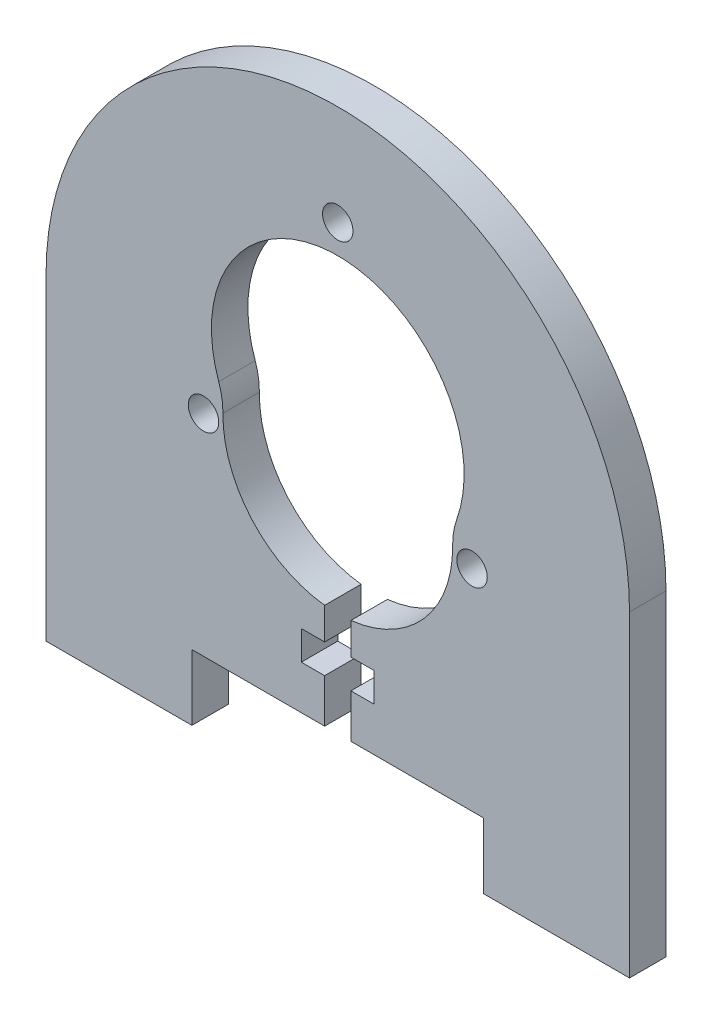
ISO-10303-21;
HEADER;
FILE_DESCRIPTION(('STEP AP214'),'2;1');
FILE_NAME('part.step','',(''),(''),'','','');
FILE_SCHEMA(('AUTOMOTIVE_DESIGN { 1 0 10303 214 1 1 1 1 }'));
ENDSEC;
DATA;
#1=APPLICATION_CONTEXT('core data for automotive mechanical design processes');
#2=APPLICATION_PROTOCOL_DEFINITION('international standard','automotive_design',2000,#1);
#3=PRODUCT_CONTEXT('',#1,'mechanical');
#4=PRODUCT('Part','Part','',(#3));
#5=PRODUCT_RELATED_PRODUCT_CATEGORY('part','',(#4));
#6=PRODUCT_DEFINITION_FORMATION('','',#4);
#7=PRODUCT_DEFINITION_CONTEXT('part definition',#1,'design');
#8=PRODUCT_DEFINITION('design','',#6,#7);
#9=PRODUCT_DEFINITION_SHAPE('','',#8);
#10=(LENGTH_UNIT() NAMED_UNIT(*) SI_UNIT(.MILLI.,.METRE.));
#11=(NAMED_UNIT(*) PLANE_ANGLE_UNIT() SI_UNIT($,.RADIAN.));
#12=(NAMED_UNIT(*) SI_UNIT($,.STERADIAN.) SOLID_ANGLE_UNIT());
#13=UNCERTAINTY_MEASURE_WITH_UNIT(LENGTH_MEASURE(1.E-05),#10,'distance_accuracy_value','');
#14=(GEOMETRIC_REPRESENTATION_CONTEXT(3) GLOBAL_UNCERTAINTY_ASSIGNED_CONTEXT((#13)) GLOBAL_UNIT_ASSIGNED_CONTEXT((#10,
#11,#12)) REPRESENTATION_CONTEXT('',''));
#15=CARTESIAN_POINT('',(0.,0.,0.));
#16=DIRECTION('',(0.,0.,1.));
#17=DIRECTION('',(1.,0.,0.));
#18=AXIS2_PLACEMENT_3D('',#15,#16,#17);
#19=CARTESIAN_POINT('',(0.,16.964919969,-0.00100000000000013));
#20=DIRECTION('',(0.,0.,1.));
#21=DIRECTION('',(1.,0.,0.));
#22=AXIS2_PLACEMENT_3D('',#19,#20,#21);
#23=CYLINDRICAL_SURFACE('',#22,11.);
#24=CARTESIAN_POINT('',(0.,16.964919969,3.175));
#25=DIRECTION('',(0.,0.,1.));
#26=DIRECTION('',(1.,0.,0.));
#27=AXIS2_PLACEMENT_3D('',#24,#25,#26);
#28=CIRCLE('',#27,11.);
#29=CARTESIAN_POINT('',(10.3652819521577,13.2824031594968,3.175));
#30=VERTEX_POINT('',#29);
#31=CARTESIAN_POINT('',(-10.3652819521577,13.2824031594968,3.175));
#32=VERTEX_POINT('',#31);
#33=EDGE_CURVE('E324',#30,#32,#28,.T.);
#34=ORIENTED_EDGE('',*,*,#33,.T.);
#35=DIRECTION('',(0.,0.,1.));
#36=VECTOR('',#35,1.);
#37=CARTESIAN_POINT('',(-10.3652819521577,13.2824031594968,-0.00100000000000013));
#38=LINE('',#37,#36);
#39=CARTESIAN_POINT('',(-10.3652819521577,13.2824031594968,0.));
#40=VERTEX_POINT('',#39);
#41=EDGE_CURVE('E55',#32,#40,#38,.F.);
#42=ORIENTED_EDGE('',*,*,#41,.T.);
#43=CARTESIAN_POINT('',(0.,16.964919969,0.));
#44=DIRECTION('',(0.,0.,-1.));
#45=DIRECTION('',(-1.,0.,0.));
#46=AXIS2_PLACEMENT_3D('',#43,#44,#45);
#47=CIRCLE('',#46,11.);
#48=CARTESIAN_POINT('',(10.3652819521577,13.2824031594968,0.));
#49=VERTEX_POINT('',#48);
#50=EDGE_CURVE('E317',#49,#40,#47,.F.);
#51=ORIENTED_EDGE('',*,*,#50,.F.);
#52=DIRECTION('',(0.,0.,1.));
#53=VECTOR('',#52,1.);
#54=CARTESIAN_POINT('',(10.3652819521577,13.2824031594968,-0.00100000000000013));
#55=LINE('',#54,#53);
#56=EDGE_CURVE('E369',#49,#30,#55,.T.);
#57=ORIENTED_EDGE('',*,*,#56,.T.);
#58=EDGE_LOOP('',(#34,#42,#51,#57));
#59=FACE_BOUND('',#58,.T.);
#60=ADVANCED_FACE('F33',(#59),#23,.F.);
#61=CARTESIAN_POINT('',(-1.14300000000001,-1.73507996900001,-0.00100000000000013));
#62=DIRECTION('',(-1.,0.,0.));
#63=DIRECTION('',(0.,-1.,0.));
#64=AXIS2_PLACEMENT_3D('',#61,#62,#63);
#65=PLANE('',#64);
#66=DIRECTION('',(0.,0.,-1.));
#67=VECTOR('',#66,1.);
#68=CARTESIAN_POINT('',(-1.14300000000001,1.03045723727027,3.175));
#69=LINE('',#68,#67);
#70=CARTESIAN_POINT('',(-1.14300000000001,1.03045723727027,3.175));
#71=VERTEX_POINT('',#70);
#72=CARTESIAN_POINT('',(-1.14300000000001,1.03045723727027,0.));
#73=VERTEX_POINT('',#72);
#74=EDGE_CURVE('E210',#71,#73,#69,.T.);
#75=ORIENTED_EDGE('',*,*,#74,.F.);
#76=DIRECTION('',(0.,-1.,0.));
#77=VECTOR('',#76,1.);
#78=CARTESIAN_POINT('',(-1.14300000000001,-1.73507996900001,3.175));
#79=LINE('',#78,#77);
#80=CARTESIAN_POINT('',(-1.14300000000001,-1.73507996900001,3.175));
#81=VERTEX_POINT('',#80);
#82=EDGE_CURVE('E269',#71,#81,#79,.T.);
#83=ORIENTED_EDGE('',*,*,#82,.T.);
#84=DIRECTION('',(0.,0.,1.));
#85=VECTOR('',#84,1.);
#86=CARTESIAN_POINT('',(-1.14300000000001,-1.73507996900001,-0.00100000000000013));
#87=LINE('',#86,#85);
#88=CARTESIAN_POINT('',(-1.14300000000001,-1.73507996900001,0.));
#89=VERTEX_POINT('',#88);
#90=EDGE_CURVE('E221',#89,#81,#87,.T.);
#91=ORIENTED_EDGE('',*,*,#90,.F.);
#92=DIRECTION('',(0.,-1.,0.));
#93=VECTOR('',#92,1.);
#94=CARTESIAN_POINT('',(-1.14300000000001,-1.73507996900001,0.));
#95=LINE('',#94,#93);
#96=EDGE_CURVE('E200',#73,#89,#95,.T.);
#97=ORIENTED_EDGE('',*,*,#96,.F.);
#98=EDGE_LOOP('',(#75,#83,#91,#97));
#99=FACE_BOUND('',#98,.T.);
#100=ADVANCED_FACE('F219',(#99),#65,.F.);
#101=CARTESIAN_POINT('',(1.14300000000001,-1.73507996900001,-0.00100000000000013));
#102=DIRECTION('',(1.,0.,0.));
#103=DIRECTION('',(0.,1.,0.));
#104=AXIS2_PLACEMENT_3D('',#101,#102,#103);
#105=PLANE('',#104);
#106=DIRECTION('',(0.,0.,-1.));
#107=VECTOR('',#106,1.);
#108=CARTESIAN_POINT('',(1.143,1.03045723727027,3.175));
#109=LINE('',#108,#107);
#110=CARTESIAN_POINT('',(1.143,1.03045723727027,0.));
#111=VERTEX_POINT('',#110);
#112=CARTESIAN_POINT('',(1.143,1.03045723727027,3.175));
#113=VERTEX_POINT('',#112);
#114=EDGE_CURVE('E361',#111,#113,#109,.F.);
#115=ORIENTED_EDGE('',*,*,#114,.F.);
#116=DIRECTION('',(0.,1.,0.));
#117=VECTOR('',#116,1.);
#118=CARTESIAN_POINT('',(1.14300000000001,-1.73507996900001,0.));
#119=LINE('',#118,#117);
#120=CARTESIAN_POINT('',(1.14300000000001,-1.73507996900001,0.));
#121=VERTEX_POINT('',#120);
#122=EDGE_CURVE('E240',#121,#111,#119,.T.);
#123=ORIENTED_EDGE('',*,*,#122,.F.);
#124=DIRECTION('',(0.,0.,1.));
#125=VECTOR('',#124,1.);
#126=CARTESIAN_POINT('',(1.14300000000001,-1.73507996900001,-0.00100000000000013));
#127=LINE('',#126,#125);
#128=CARTESIAN_POINT('',(1.14300000000001,-1.73507996900001,3.175));
#129=VERTEX_POINT('',#128);
#130=EDGE_CURVE('E274',#121,#129,#127,.T.);
#131=ORIENTED_EDGE('',*,*,#130,.T.);
#132=DIRECTION('',(0.,1.,0.));
#133=VECTOR('',#132,1.);
#134=CARTESIAN_POINT('',(1.14300000000001,-1.73507996900001,3.175));
#135=LINE('',#134,#133);
#136=EDGE_CURVE('E266',#129,#113,#135,.T.);
#137=ORIENTED_EDGE('',*,*,#136,.T.);
#138=EDGE_LOOP('',(#115,#123,#131,#137));
#139=FACE_BOUND('',#138,.T.);
#140=ADVANCED_FACE('F466',(#139),#105,.F.);
#141=CARTESIAN_POINT('',(-12.7,-8.08507996900001,-0.00100000000000013));
#142=DIRECTION('',(0.,1.,0.));
#143=DIRECTION('',(0.,0.,1.));
#144=AXIS2_PLACEMENT_3D('',#141,#142,#143);
#145=PLANE('',#144);
#146=DIRECTION('',(-1.,0.,0.));
#147=VECTOR('',#146,1.);
#148=CARTESIAN_POINT('',(-12.7,-8.08507996900001,3.175));
#149=LINE('',#148,#147);
#150=CARTESIAN_POINT('',(12.7,-8.08507996900001,3.175));
#151=VERTEX_POINT('',#150);
#152=CARTESIAN_POINT('',(1.14300000000002,-8.08507996900001,3.175));
#153=VERTEX_POINT('',#152);
#154=EDGE_CURVE('E310',#151,#153,#149,.T.);
#155=ORIENTED_EDGE('',*,*,#154,.T.);
#156=DIRECTION('',(0.,0.,1.));
#157=VECTOR('',#156,1.);
#158=CARTESIAN_POINT('',(1.14300000000002,-8.08507996900001,-0.00100000000000013));
#159=LINE('',#158,#157);
#160=CARTESIAN_POINT('',(1.14300000000001,-8.08507996900001,0.));
#161=VERTEX_POINT('',#160);
#162=EDGE_CURVE('E282',#161,#153,#159,.T.);
#163=ORIENTED_EDGE('',*,*,#162,.F.);
#164=DIRECTION('',(-1.,0.,0.));
#165=VECTOR('',#164,1.);
#166=CARTESIAN_POINT('',(-12.7,-8.08507996900001,0.));
#167=LINE('',#166,#165);
#168=CARTESIAN_POINT('',(12.7,-8.08507996900001,0.));
#169=VERTEX_POINT('',#168);
#170=EDGE_CURVE('E298',#169,#161,#167,.T.);
#171=ORIENTED_EDGE('',*,*,#170,.F.);
#172=DIRECTION('',(0.,0.,1.));
#173=VECTOR('',#172,1.);
#174=CARTESIAN_POINT('',(12.7,-8.08507996900001,-0.00100000000000013));
#175=LINE('',#174,#173);
#176=EDGE_CURVE('E318',#169,#151,#175,.T.);
#177=ORIENTED_EDGE('',*,*,#176,.T.);
#178=EDGE_LOOP('',(#155,#163,#171,#177));
#179=FACE_BOUND('',#178,.T.);
#180=ADVANCED_FACE('F449',(#179),#145,.F.);
#181=CARTESIAN_POINT('',(25.4,-13.800079969,3.175));
#182=DIRECTION('',(0.,1.,0.));
#183=DIRECTION('',(-1.,0.,0.));
#184=AXIS2_PLACEMENT_3D('',#181,#182,#183);
#185=PLANE('',#184);
#186=DIRECTION('',(1.,0.,0.));
#187=VECTOR('',#186,1.);
#188=CARTESIAN_POINT('',(25.4,-13.800079969,0.));
#189=LINE('',#188,#187);
#190=CARTESIAN_POINT('',(-25.4,-13.800079969,0.));
#191=VERTEX_POINT('',#190);
#192=CARTESIAN_POINT('',(-12.7,-13.800079969,0.));
#193=VERTEX_POINT('',#192);
#194=EDGE_CURVE('E346',#191,#193,#189,.T.);
#195=ORIENTED_EDGE('',*,*,#194,.T.);
#196=DIRECTION('',(0.,0.,1.));
#197=VECTOR('',#196,1.);
#198=CARTESIAN_POINT('',(-12.7,-13.800079969,-0.00100000000000013));
#199=LINE('',#198,#197);
#200=CARTESIAN_POINT('',(-12.7,-13.800079969,3.175));
#201=VERTEX_POINT('',#200);
#202=EDGE_CURVE('E313',#193,#201,#199,.T.);
#203=ORIENTED_EDGE('',*,*,#202,.T.);
#204=DIRECTION('',(1.,0.,0.));
#205=VECTOR('',#204,1.);
#206=CARTESIAN_POINT('',(25.4,-13.800079969,3.175));
#207=LINE('',#206,#205);
#208=CARTESIAN_POINT('',(-25.4,-13.800079969,3.175));
#209=VERTEX_POINT('',#208);
#210=EDGE_CURVE('E335',#209,#201,#207,.T.);
#211=ORIENTED_EDGE('',*,*,#210,.F.);
#212=DIRECTION('',(0.,0.,-1.));
#213=VECTOR('',#212,1.);
#214=CARTESIAN_POINT('',(-25.4,-13.800079969,3.175));
#215=LINE('',#214,#213);
#216=EDGE_CURVE('E355',#209,#191,#215,.T.);
#217=ORIENTED_EDGE('',*,*,#216,.T.);
#218=EDGE_LOOP('',(#195,#203,#211,#217));
#219=FACE_BOUND('',#218,.T.);
#220=ADVANCED_FACE('F421',(#219),#185,.F.);
#221=CARTESIAN_POINT('',(0.,13.800079969,3.175));
#222=DIRECTION('',(0.,0.,-1.));
#223=DIRECTION('',(-1.,0.,0.));
#224=AXIS2_PLACEMENT_3D('',#221,#222,#223);
#225=CYLINDRICAL_SURFACE('',#224,25.4);
#226=CARTESIAN_POINT('',(0.,13.800079969,0.));
#227=DIRECTION('',(0.,0.,1.));
#228=DIRECTION('',(-1.,0.,0.));
#229=AXIS2_PLACEMENT_3D('',#226,#227,#228);
#230=CIRCLE('',#229,25.4);
#231=CARTESIAN_POINT('',(25.4,13.800079969,0.));
#232=VERTEX_POINT('',#231);
#233=CARTESIAN_POINT('',(-25.4,13.800079969,0.));
#234=VERTEX_POINT('',#233);
#235=EDGE_CURVE('E326',#232,#234,#230,.T.);
#236=ORIENTED_EDGE('',*,*,#235,.T.);
#237=DIRECTION('',(0.,0.,-1.));
#238=VECTOR('',#237,1.);
#239=CARTESIAN_POINT('',(-25.4,13.800079969,3.175));
#240=LINE('',#239,#238);
#241=CARTESIAN_POINT('',(-25.4,13.800079969,3.175));
#242=VERTEX_POINT('',#241);
#243=EDGE_CURVE('E358',#242,#234,#240,.T.);
#244=ORIENTED_EDGE('',*,*,#243,.F.);
#245=CARTESIAN_POINT('',(0.,13.800079969,3.175));
#246=DIRECTION('',(0.,0.,1.));
#247=DIRECTION('',(-1.,0.,0.));
#248=AXIS2_PLACEMENT_3D('',#245,#246,#247);
#249=CIRCLE('',#248,25.4);
#250=CARTESIAN_POINT('',(25.4,13.800079969,3.175));
#251=VERTEX_POINT('',#250);
#252=EDGE_CURVE('E328',#251,#242,#249,.T.);
#253=ORIENTED_EDGE('',*,*,#252,.F.);
#254=DIRECTION('',(0.,0.,-1.));
#255=VECTOR('',#254,1.);
#256=CARTESIAN_POINT('',(25.4,13.800079969,3.175));
#257=LINE('',#256,#255);
#258=EDGE_CURVE('E340',#251,#232,#257,.T.);
#259=ORIENTED_EDGE('',*,*,#258,.T.);
#260=EDGE_LOOP('',(#236,#244,#253,#259));
#261=FACE_BOUND('',#260,.T.);
#262=ADVANCED_FACE('F430',(#261),#225,.T.);
#263=CARTESIAN_POINT('',(-25.4,-13.800079969,3.175));
#264=DIRECTION('',(1.,0.,0.));
#265=DIRECTION('',(0.,1.,0.));
#266=AXIS2_PLACEMENT_3D('',#263,#264,#265);
#267=PLANE('',#266);
#268=DIRECTION('',(0.,-1.,0.));
#269=VECTOR('',#268,1.);
#270=CARTESIAN_POINT('',(-25.4,-13.800079969,0.));
#271=LINE('',#270,#269);
#272=EDGE_CURVE('E343',#234,#191,#271,.T.);
#273=ORIENTED_EDGE('',*,*,#272,.T.);
#274=ORIENTED_EDGE('',*,*,#216,.F.);
#275=DIRECTION('',(0.,-1.,0.));
#276=VECTOR('',#275,1.);
#277=CARTESIAN_POINT('',(-25.4,-13.800079969,3.175));
#278=LINE('',#277,#276);
#279=EDGE_CURVE('E331',#242,#209,#278,.T.);
#280=ORIENTED_EDGE('',*,*,#279,.F.);
#281=ORIENTED_EDGE('',*,*,#243,.T.);
#282=EDGE_LOOP('',(#273,#274,#280,#281));
#283=FACE_BOUND('',#282,.T.);
#284=ADVANCED_FACE('F427',(#283),#267,.F.);
#285=CARTESIAN_POINT('',(12.7,-13.800079969,3.175));
#286=VERTEX_POINT('',#285);
#287=CARTESIAN_POINT('',(25.4,-13.800079969,3.175));
#288=VERTEX_POINT('',#287);
#289=EDGE_CURVE('E334',#286,#288,#207,.T.);
#290=ORIENTED_EDGE('',*,*,#289,.F.);
#291=DIRECTION('',(0.,0.,1.));
#292=VECTOR('',#291,1.);
#293=CARTESIAN_POINT('',(12.7,-13.800079969,-0.00100000000000013));
#294=LINE('',#293,#292);
#295=CARTESIAN_POINT('',(12.7,-13.800079969,0.));
#296=VERTEX_POINT('',#295);
#297=EDGE_CURVE('E320',#296,#286,#294,.T.);
#298=ORIENTED_EDGE('',*,*,#297,.F.);
#299=CARTESIAN_POINT('',(25.4,-13.800079969,0.));
#300=VERTEX_POINT('',#299);
#301=EDGE_CURVE('E345',#296,#300,#189,.T.);
#302=ORIENTED_EDGE('',*,*,#301,.T.);
#303=DIRECTION('',(0.,0.,-1.));
#304=VECTOR('',#303,1.);
#305=CARTESIAN_POINT('',(25.4,-13.800079969,3.175));
#306=LINE('',#305,#304);
#307=EDGE_CURVE('E352',#288,#300,#306,.T.);
#308=ORIENTED_EDGE('',*,*,#307,.F.);
#309=EDGE_LOOP('',(#290,#298,#302,#308));
#310=FACE_BOUND('',#309,.T.);
#311=ADVANCED_FACE('F440',(#310),#185,.F.);
#312=CARTESIAN_POINT('',(25.4,-13.800079969,3.175));
#313=DIRECTION('',(-1.,0.,0.));
#314=DIRECTION('',(0.,-1.,0.));
#315=AXIS2_PLACEMENT_3D('',#312,#313,#314);
#316=PLANE('',#315);
#317=DIRECTION('',(0.,1.,0.));
#318=VECTOR('',#317,1.);
#319=CARTESIAN_POINT('',(25.4,-13.800079969,0.));
#320=LINE('',#319,#318);
#321=EDGE_CURVE('E332',#300,#232,#320,.T.);
#322=ORIENTED_EDGE('',*,*,#321,.T.);
#323=ORIENTED_EDGE('',*,*,#258,.F.);
#324=DIRECTION('',(0.,1.,0.));
#325=VECTOR('',#324,1.);
#326=CARTESIAN_POINT('',(25.4,-13.800079969,3.175));
#327=LINE('',#326,#325);
#328=EDGE_CURVE('E338',#288,#251,#327,.T.);
#329=ORIENTED_EDGE('',*,*,#328,.F.);
#330=ORIENTED_EDGE('',*,*,#307,.T.);
#331=EDGE_LOOP('',(#322,#323,#329,#330));
#332=FACE_BOUND('',#331,.T.);
#333=ADVANCED_FACE('F434',(#332),#316,.F.);
#334=CARTESIAN_POINT('',(0.,13.800079969,3.175));
#335=DIRECTION('',(0.,0.,-1.));
#336=DIRECTION('',(-1.,0.,0.));
#337=AXIS2_PLACEMENT_3D('',#334,#335,#336);
#338=PLANE('',#337);
#339=CARTESIAN_POINT('',(0.,10.964920031,3.175));
#340=DIRECTION('',(0.,0.,1.));
#341=DIRECTION('',(1.,0.,0.));
#342=AXIS2_PLACEMENT_3D('',#339,#340,#341);
#343=CIRCLE('',#342,10.);
#344=CARTESIAN_POINT('',(-9.99931286460586,11.082147313353,3.175));
#345=VERTEX_POINT('',#344);
#346=EDGE_CURVE('E213',#345,#71,#343,.T.);
#347=ORIENTED_EDGE('',*,*,#346,.F.);
#348=CARTESIAN_POINT('',(-16.3488765336306,11.1565866376472,3.175));
#349=DIRECTION('',(0.,0.,-1.));
#350=DIRECTION('',(-1.,0.,0.));
#351=AXIS2_PLACEMENT_3D('',#348,#349,#350);
#352=CIRCLE('',#351,6.35);
#353=EDGE_CURVE('E367',#345,#32,#352,.F.);
#354=ORIENTED_EDGE('',*,*,#353,.T.);
#355=ORIENTED_EDGE('',*,*,#33,.F.);
#356=CARTESIAN_POINT('',(16.3488765336306,11.1565866376472,3.175));
#357=DIRECTION('',(0.,0.,-1.));
#358=DIRECTION('',(-1.,0.,0.));
#359=AXIS2_PLACEMENT_3D('',#356,#357,#358);
#360=CIRCLE('',#359,6.35);
#361=CARTESIAN_POINT('',(9.99931286460586,11.082147313353,3.175));
#362=VERTEX_POINT('',#361);
#363=EDGE_CURVE('E365',#30,#362,#360,.F.);
#364=ORIENTED_EDGE('',*,*,#363,.T.);
#365=EDGE_CURVE('E206',#113,#362,#343,.T.);
#366=ORIENTED_EDGE('',*,*,#365,.F.);
#367=ORIENTED_EDGE('',*,*,#136,.F.);
#368=DIRECTION('',(-1.,0.,0.));
#369=VECTOR('',#368,1.);
#370=CARTESIAN_POINT('',(3.175,-1.73507996900001,3.175));
#371=LINE('',#370,#369);
#372=CARTESIAN_POINT('',(3.175,-1.73507996900001,3.175));
#373=VERTEX_POINT('',#372);
#374=EDGE_CURVE('E263',#373,#129,#371,.T.);
#375=ORIENTED_EDGE('',*,*,#374,.F.);
#376=DIRECTION('',(0.,1.,0.));
#377=VECTOR('',#376,1.);
#378=CARTESIAN_POINT('',(3.175,-4.27507996900001,3.175));
#379=LINE('',#378,#377);
#380=CARTESIAN_POINT('',(3.175,-4.27507996900001,3.175));
#381=VERTEX_POINT('',#380);
#382=EDGE_CURVE('E260',#381,#373,#379,.T.);
#383=ORIENTED_EDGE('',*,*,#382,.F.);
#384=DIRECTION('',(1.,0.,0.));
#385=VECTOR('',#384,1.);
#386=CARTESIAN_POINT('',(3.175,-4.27507996900001,3.175));
#387=LINE('',#386,#385);
#388=CARTESIAN_POINT('',(1.14300000000001,-4.27507996900001,3.175));
#389=VERTEX_POINT('',#388);
#390=EDGE_CURVE('E257',#389,#381,#387,.T.);
#391=ORIENTED_EDGE('',*,*,#390,.F.);
#392=DIRECTION('',(0.,1.,0.));
#393=VECTOR('',#392,1.);
#394=CARTESIAN_POINT('',(1.14300000000002,-8.08507996900001,3.175));
#395=LINE('',#394,#393);
#396=EDGE_CURVE('E254',#153,#389,#395,.T.);
#397=ORIENTED_EDGE('',*,*,#396,.F.);
#398=ORIENTED_EDGE('',*,*,#154,.F.);
#399=DIRECTION('',(0.,1.,0.));
#400=VECTOR('',#399,1.);
#401=CARTESIAN_POINT('',(12.7,-13.800079969,3.175));
#402=LINE('',#401,#400);
#403=EDGE_CURVE('E306',#286,#151,#402,.T.);
#404=ORIENTED_EDGE('',*,*,#403,.F.);
#405=ORIENTED_EDGE('',*,*,#289,.T.);
#406=ORIENTED_EDGE('',*,*,#328,.T.);
#407=ORIENTED_EDGE('',*,*,#252,.T.);
#408=ORIENTED_EDGE('',*,*,#279,.T.);
#409=ORIENTED_EDGE('',*,*,#210,.T.);
#410=DIRECTION('',(0.,-1.,0.));
#411=VECTOR('',#410,1.);
#412=CARTESIAN_POINT('',(-12.7,-13.800079969,3.175));
#413=LINE('',#412,#411);
#414=CARTESIAN_POINT('',(-12.7,-8.08507996900001,3.175));
#415=VERTEX_POINT('',#414);
#416=EDGE_CURVE('E304',#415,#201,#413,.T.);
#417=ORIENTED_EDGE('',*,*,#416,.F.);
#418=CARTESIAN_POINT('',(-1.14300000000001,-8.08507996900001,3.175));
#419=VERTEX_POINT('',#418);
#420=EDGE_CURVE('E309',#419,#415,#149,.T.);
#421=ORIENTED_EDGE('',*,*,#420,.F.);
#422=DIRECTION('',(0.,-1.,0.));
#423=VECTOR('',#422,1.);
#424=CARTESIAN_POINT('',(-1.14300000000001,-8.08507996900001,3.175));
#425=LINE('',#424,#423);
#426=CARTESIAN_POINT('',(-1.14300000000001,-4.27507996900001,3.175));
#427=VERTEX_POINT('',#426);
#428=EDGE_CURVE('E252',#427,#419,#425,.T.);
#429=ORIENTED_EDGE('',*,*,#428,.F.);
#430=DIRECTION('',(1.,0.,0.));
#431=VECTOR('',#430,1.);
#432=CARTESIAN_POINT('',(-1.14300000000001,-4.27507996900001,3.175));
#433=LINE('',#432,#431);
#434=CARTESIAN_POINT('',(-3.17499999999999,-4.27507996900001,3.175));
#435=VERTEX_POINT('',#434);
#436=EDGE_CURVE('E249',#435,#427,#433,.T.);
#437=ORIENTED_EDGE('',*,*,#436,.F.);
#438=DIRECTION('',(0.,-1.,0.));
#439=VECTOR('',#438,1.);
#440=CARTESIAN_POINT('',(-3.17499999999999,-4.27507996900001,3.175));
#441=LINE('',#440,#439);
#442=CARTESIAN_POINT('',(-3.17499999999999,-1.73507996900001,3.175));
#443=VERTEX_POINT('',#442);
#444=EDGE_CURVE('E246',#443,#435,#441,.T.);
#445=ORIENTED_EDGE('',*,*,#444,.F.);
#446=DIRECTION('',(-1.,0.,0.));
#447=VECTOR('',#446,1.);
#448=CARTESIAN_POINT('',(-1.14300000000001,-1.73507996900001,3.175));
#449=LINE('',#448,#447);
#450=EDGE_CURVE('E243',#81,#443,#449,.T.);
#451=ORIENTED_EDGE('',*,*,#450,.F.);
#452=ORIENTED_EDGE('',*,*,#82,.F.);
#453=EDGE_LOOP('',(#347,#354,#355,#364,#366,#367,#375,#383,#391,#397,#398,#404,#405,#406,#407,
#408,#409,#417,#421,#429,#437,#445,#451,#452));
#454=FACE_BOUND('',#453,.T.);
#455=CARTESIAN_POINT('',(0.,30.464919969,3.175));
#456=DIRECTION('',(0.,0.,1.));
#457=DIRECTION('',(1.,0.,0.));
#458=AXIS2_PLACEMENT_3D('',#455,#456,#457);
#459=CIRCLE('',#458,1.3250037);
#460=CARTESIAN_POINT('',(1.3250037,30.464919969,3.175));
#461=VERTEX_POINT('',#460);
#462=EDGE_CURVE('E386',#461,#461,#459,.T.);
#463=ORIENTED_EDGE('',*,*,#462,.F.);
#464=EDGE_LOOP('',(#463));
#465=FACE_BOUND('',#464,.T.);
#466=CARTESIAN_POINT('',(11.6913429510899,10.214919969,3.175));
#467=DIRECTION('',(0.,0.,1.));
#468=DIRECTION('',(1.,0.,0.));
#469=AXIS2_PLACEMENT_3D('',#466,#467,#468);
#470=CIRCLE('',#469,1.3250037);
#471=CARTESIAN_POINT('',(13.0163466510899,10.214919969,3.175));
#472=VERTEX_POINT('',#471);
#473=EDGE_CURVE('E393',#472,#472,#470,.T.);
#474=ORIENTED_EDGE('',*,*,#473,.F.);
#475=EDGE_LOOP('',(#474));
#476=FACE_BOUND('',#475,.T.);
#477=CARTESIAN_POINT('',(-11.6913429510899,10.214919969,3.175));
#478=DIRECTION('',(0.,0.,1.));
#479=DIRECTION('',(1.,0.,0.));
#480=AXIS2_PLACEMENT_3D('',#477,#478,#479);
#481=CIRCLE('',#480,1.3250037);
#482=CARTESIAN_POINT('',(-10.3663392510899,10.214919969,3.175));
#483=VERTEX_POINT('',#482);
#484=EDGE_CURVE('E399',#483,#483,#481,.T.);
#485=ORIENTED_EDGE('',*,*,#484,.F.);
#486=EDGE_LOOP('',(#485));
#487=FACE_BOUND('',#486,.T.);
#488=ADVANCED_FACE('F378',(#454,#465,#476,#487),#338,.F.);
#489=CARTESIAN_POINT('',(0.,13.800079969,0.));
#490=DIRECTION('',(0.,0.,-1.));
#491=DIRECTION('',(-1.,0.,0.));
#492=AXIS2_PLACEMENT_3D('',#489,#490,#491);
#493=PLANE('',#492);
#494=CARTESIAN_POINT('',(0.,30.464919969,0.));
#495=DIRECTION('',(0.,0.,1.));
#496=DIRECTION('',(1.,0.,0.));
#497=AXIS2_PLACEMENT_3D('',#494,#495,#496);
#498=CIRCLE('',#497,1.3250037);
#499=CARTESIAN_POINT('',(1.3250037,30.464919969,0.));
#500=VERTEX_POINT('',#499);
#501=EDGE_CURVE('E390',#500,#500,#498,.T.);
#502=ORIENTED_EDGE('',*,*,#501,.T.);
#503=EDGE_LOOP('',(#502));
#504=FACE_BOUND('',#503,.T.);
#505=CARTESIAN_POINT('',(11.6913429510899,10.214919969,0.));
#506=DIRECTION('',(0.,0.,1.));
#507=DIRECTION('',(1.,0.,0.));
#508=AXIS2_PLACEMENT_3D('',#505,#506,#507);
#509=CIRCLE('',#508,1.3250037);
#510=CARTESIAN_POINT('',(13.0163466510899,10.214919969,0.));
#511=VERTEX_POINT('',#510);
#512=EDGE_CURVE('E396',#511,#511,#509,.T.);
#513=ORIENTED_EDGE('',*,*,#512,.T.);
#514=EDGE_LOOP('',(#513));
#515=FACE_BOUND('',#514,.T.);
#516=CARTESIAN_POINT('',(-11.6913429510899,10.214919969,0.));
#517=DIRECTION('',(0.,0.,1.));
#518=DIRECTION('',(1.,0.,0.));
#519=AXIS2_PLACEMENT_3D('',#516,#517,#518);
#520=CIRCLE('',#519,1.3250037);
#521=CARTESIAN_POINT('',(-10.3663392510899,10.214919969,0.));
#522=VERTEX_POINT('',#521);
#523=EDGE_CURVE('E216',#522,#522,#520,.T.);
#524=ORIENTED_EDGE('',*,*,#523,.T.);
#525=EDGE_LOOP('',(#524));
#526=FACE_BOUND('',#525,.T.);
#527=ORIENTED_EDGE('',*,*,#50,.T.);
#528=CARTESIAN_POINT('',(-16.3488765336306,11.1565866376472,0.));
#529=DIRECTION('',(0.,0.,-1.));
#530=DIRECTION('',(-1.,0.,0.));
#531=AXIS2_PLACEMENT_3D('',#528,#529,#530);
#532=CIRCLE('',#531,6.35);
#533=CARTESIAN_POINT('',(-9.99931286460586,11.082147313353,0.));
#534=VERTEX_POINT('',#533);
#535=EDGE_CURVE('E41',#40,#534,#532,.T.);
#536=ORIENTED_EDGE('',*,*,#535,.T.);
#537=CARTESIAN_POINT('',(0.,10.964920031,0.));
#538=DIRECTION('',(0.,0.,1.));
#539=DIRECTION('',(1.,0.,0.));
#540=AXIS2_PLACEMENT_3D('',#537,#538,#539);
#541=CIRCLE('',#540,10.);
#542=EDGE_CURVE('E195',#534,#73,#541,.T.);
#543=ORIENTED_EDGE('',*,*,#542,.T.);
#544=ORIENTED_EDGE('',*,*,#96,.T.);
#545=DIRECTION('',(-1.,0.,0.));
#546=VECTOR('',#545,1.);
#547=CARTESIAN_POINT('',(-1.14300000000001,-1.73507996900001,0.));
#548=LINE('',#547,#546);
#549=CARTESIAN_POINT('',(-3.17499999999999,-1.73507996900001,0.));
#550=VERTEX_POINT('',#549);
#551=EDGE_CURVE('E223',#89,#550,#548,.T.);
#552=ORIENTED_EDGE('',*,*,#551,.T.);
#553=DIRECTION('',(0.,-1.,0.));
#554=VECTOR('',#553,1.);
#555=CARTESIAN_POINT('',(-3.17499999999999,-4.27507996900001,0.));
#556=LINE('',#555,#554);
#557=CARTESIAN_POINT('',(-3.17499999999999,-4.27507996900001,0.));
#558=VERTEX_POINT('',#557);
#559=EDGE_CURVE('E273',#550,#558,#556,.T.);
#560=ORIENTED_EDGE('',*,*,#559,.T.);
#561=DIRECTION('',(1.,0.,0.));
#562=VECTOR('',#561,1.);
#563=CARTESIAN_POINT('',(-1.14300000000001,-4.27507996900001,0.));
#564=LINE('',#563,#562);
#565=CARTESIAN_POINT('',(-1.14300000000001,-4.27507996900001,0.));
#566=VERTEX_POINT('',#565);
#567=EDGE_CURVE('E389',#558,#566,#564,.T.);
#568=ORIENTED_EDGE('',*,*,#567,.T.);
#569=DIRECTION('',(0.,-1.,0.));
#570=VECTOR('',#569,1.);
#571=CARTESIAN_POINT('',(-1.14300000000001,-8.08507996900001,0.));
#572=LINE('',#571,#570);
#573=CARTESIAN_POINT('',(-1.14300000000001,-8.08507996900001,0.));
#574=VERTEX_POINT('',#573);
#575=EDGE_CURVE('E228',#566,#574,#572,.T.);
#576=ORIENTED_EDGE('',*,*,#575,.T.);
#577=CARTESIAN_POINT('',(-12.7,-8.08507996900001,0.));
#578=VERTEX_POINT('',#577);
#579=EDGE_CURVE('E297',#574,#578,#167,.T.);
#580=ORIENTED_EDGE('',*,*,#579,.T.);
#581=DIRECTION('',(0.,-1.,0.));
#582=VECTOR('',#581,1.);
#583=CARTESIAN_POINT('',(-12.7,-13.800079969,0.));
#584=LINE('',#583,#582);
#585=EDGE_CURVE('E301',#578,#193,#584,.T.);
#586=ORIENTED_EDGE('',*,*,#585,.T.);
#587=ORIENTED_EDGE('',*,*,#194,.F.);
#588=ORIENTED_EDGE('',*,*,#272,.F.);
#589=ORIENTED_EDGE('',*,*,#235,.F.);
#590=ORIENTED_EDGE('',*,*,#321,.F.);
#591=ORIENTED_EDGE('',*,*,#301,.F.);
#592=DIRECTION('',(0.,1.,0.));
#593=VECTOR('',#592,1.);
#594=CARTESIAN_POINT('',(12.7,-13.800079969,0.));
#595=LINE('',#594,#593);
#596=EDGE_CURVE('E294',#296,#169,#595,.T.);
#597=ORIENTED_EDGE('',*,*,#596,.T.);
#598=ORIENTED_EDGE('',*,*,#170,.T.);
#599=DIRECTION('',(0.,1.,0.));
#600=VECTOR('',#599,1.);
#601=CARTESIAN_POINT('',(1.14300000000002,-8.08507996900001,0.));
#602=LINE('',#601,#600);
#603=CARTESIAN_POINT('',(1.14300000000001,-4.27507996900001,0.));
#604=VERTEX_POINT('',#603);
#605=EDGE_CURVE('E222',#161,#604,#602,.T.);
#606=ORIENTED_EDGE('',*,*,#605,.T.);
#607=DIRECTION('',(1.,0.,0.));
#608=VECTOR('',#607,1.);
#609=CARTESIAN_POINT('',(3.175,-4.27507996900001,0.));
#610=LINE('',#609,#608);
#611=CARTESIAN_POINT('',(3.175,-4.27507996900001,0.));
#612=VERTEX_POINT('',#611);
#613=EDGE_CURVE('E226',#604,#612,#610,.T.);
#614=ORIENTED_EDGE('',*,*,#613,.T.);
#615=DIRECTION('',(0.,1.,0.));
#616=VECTOR('',#615,1.);
#617=CARTESIAN_POINT('',(3.175,-4.27507996900001,0.));
#618=LINE('',#617,#616);
#619=CARTESIAN_POINT('',(3.175,-1.73507996900001,0.));
#620=VERTEX_POINT('',#619);
#621=EDGE_CURVE('E234',#612,#620,#618,.T.);
#622=ORIENTED_EDGE('',*,*,#621,.T.);
#623=DIRECTION('',(-1.,0.,0.));
#624=VECTOR('',#623,1.);
#625=CARTESIAN_POINT('',(3.175,-1.73507996900001,0.));
#626=LINE('',#625,#624);
#627=EDGE_CURVE('E237',#620,#121,#626,.T.);
#628=ORIENTED_EDGE('',*,*,#627,.T.);
#629=ORIENTED_EDGE('',*,*,#122,.T.);
#630=CARTESIAN_POINT('',(9.99931286460586,11.082147313353,0.));
#631=VERTEX_POINT('',#630);
#632=EDGE_CURVE('E207',#111,#631,#541,.T.);
#633=ORIENTED_EDGE('',*,*,#632,.T.);
#634=CARTESIAN_POINT('',(16.3488765336306,11.1565866376472,0.));
#635=DIRECTION('',(0.,0.,-1.));
#636=DIRECTION('',(-1.,0.,0.));
#637=AXIS2_PLACEMENT_3D('',#634,#635,#636);
#638=CIRCLE('',#637,6.35);
#639=EDGE_CURVE('E48',#631,#49,#638,.T.);
#640=ORIENTED_EDGE('',*,*,#639,.T.);
#641=EDGE_LOOP('',(#527,#536,#543,#544,#552,#560,#568,#576,#580,#586,#587,#588,#589,#590,#591,
#597,#598,#606,#614,#622,#628,#629,#633,#640));
#642=FACE_BOUND('',#641,.T.);
#643=ADVANCED_FACE('F197',(#504,#515,#526,#642),#493,.T.);
#644=CARTESIAN_POINT('',(-12.7,-13.800079969,-0.00100000000000013));
#645=DIRECTION('',(-1.,0.,0.));
#646=DIRECTION('',(0.,0.,1.));
#647=AXIS2_PLACEMENT_3D('',#644,#645,#646);
#648=PLANE('',#647);
#649=DIRECTION('',(0.,0.,1.));
#650=VECTOR('',#649,1.);
#651=CARTESIAN_POINT('',(-12.7,-8.08507996900001,-0.00100000000000013));
#652=LINE('',#651,#650);
#653=EDGE_CURVE('E314',#578,#415,#652,.T.);
#654=ORIENTED_EDGE('',*,*,#653,.T.);
#655=ORIENTED_EDGE('',*,*,#416,.T.);
#656=ORIENTED_EDGE('',*,*,#202,.F.);
#657=ORIENTED_EDGE('',*,*,#585,.F.);
#658=EDGE_LOOP('',(#654,#655,#656,#657));
#659=FACE_BOUND('',#658,.T.);
#660=ADVANCED_FACE('F416',(#659),#648,.F.);
#661=ORIENTED_EDGE('',*,*,#579,.F.);
#662=DIRECTION('',(0.,0.,1.));
#663=VECTOR('',#662,1.);
#664=CARTESIAN_POINT('',(-1.14300000000001,-8.08507996900001,-0.00100000000000013));
#665=LINE('',#664,#663);
#666=EDGE_CURVE('E284',#574,#419,#665,.T.);
#667=ORIENTED_EDGE('',*,*,#666,.T.);
#668=ORIENTED_EDGE('',*,*,#420,.T.);
#669=ORIENTED_EDGE('',*,*,#653,.F.);
#670=EDGE_LOOP('',(#661,#667,#668,#669));
#671=FACE_BOUND('',#670,.T.);
#672=ADVANCED_FACE('F412',(#671),#145,.F.);
#673=CARTESIAN_POINT('',(12.7,-13.800079969,-0.00100000000000013));
#674=DIRECTION('',(1.,0.,0.));
#675=DIRECTION('',(0.,0.,-1.));
#676=AXIS2_PLACEMENT_3D('',#673,#674,#675);
#677=PLANE('',#676);
#678=ORIENTED_EDGE('',*,*,#297,.T.);
#679=ORIENTED_EDGE('',*,*,#403,.T.);
#680=ORIENTED_EDGE('',*,*,#176,.F.);
#681=ORIENTED_EDGE('',*,*,#596,.F.);
#682=EDGE_LOOP('',(#678,#679,#680,#681));
#683=FACE_BOUND('',#682,.T.);
#684=ADVANCED_FACE('F443',(#683),#677,.F.);
#685=CARTESIAN_POINT('',(-1.14300000000001,-8.08507996900001,-0.00100000000000013));
#686=DIRECTION('',(-1.,0.,0.));
#687=DIRECTION('',(0.,-1.,0.));
#688=AXIS2_PLACEMENT_3D('',#685,#686,#687);
#689=PLANE('',#688);
#690=DIRECTION('',(0.,0.,1.));
#691=VECTOR('',#690,1.);
#692=CARTESIAN_POINT('',(-1.14300000000001,-4.27507996900001,-0.00100000000000013));
#693=LINE('',#692,#691);
#694=EDGE_CURVE('E287',#566,#427,#693,.T.);
#695=ORIENTED_EDGE('',*,*,#694,.T.);
#696=ORIENTED_EDGE('',*,*,#428,.T.);
#697=ORIENTED_EDGE('',*,*,#666,.F.);
#698=ORIENTED_EDGE('',*,*,#575,.F.);
#699=EDGE_LOOP('',(#695,#696,#697,#698));
#700=FACE_BOUND('',#699,.T.);
#701=ADVANCED_FACE('F514',(#700),#689,.F.);
#702=CARTESIAN_POINT('',(-3.17499999999999,-4.27507996900001,-0.00100000000000013));
#703=DIRECTION('',(-1.,0.,0.));
#704=DIRECTION('',(0.,0.,1.));
#705=AXIS2_PLACEMENT_3D('',#702,#703,#704);
#706=PLANE('',#705);
#707=DIRECTION('',(0.,0.,1.));
#708=VECTOR('',#707,1.);
#709=CARTESIAN_POINT('',(-3.17499999999999,-1.73507996900001,-0.00100000000000013));
#710=LINE('',#709,#708);
#711=EDGE_CURVE('E271',#550,#443,#710,.T.);
#712=ORIENTED_EDGE('',*,*,#711,.T.);
#713=ORIENTED_EDGE('',*,*,#444,.T.);
#714=DIRECTION('',(0.,0.,1.));
#715=VECTOR('',#714,1.);
#716=CARTESIAN_POINT('',(-3.17499999999999,-4.27507996900001,-0.00100000000000013));
#717=LINE('',#716,#715);
#718=EDGE_CURVE('E289',#558,#435,#717,.T.);
#719=ORIENTED_EDGE('',*,*,#718,.F.);
#720=ORIENTED_EDGE('',*,*,#559,.F.);
#721=EDGE_LOOP('',(#712,#713,#719,#720));
#722=FACE_BOUND('',#721,.T.);
#723=ADVANCED_FACE('F510',(#722),#706,.F.);
#724=CARTESIAN_POINT('',(-1.14300000000001,-4.27507996900001,-0.00100000000000013));
#725=DIRECTION('',(0.,-1.,0.));
#726=DIRECTION('',(0.,0.,-1.));
#727=AXIS2_PLACEMENT_3D('',#724,#725,#726);
#728=PLANE('',#727);
#729=ORIENTED_EDGE('',*,*,#718,.T.);
#730=ORIENTED_EDGE('',*,*,#436,.T.);
#731=ORIENTED_EDGE('',*,*,#694,.F.);
#732=ORIENTED_EDGE('',*,*,#567,.F.);
#733=EDGE_LOOP('',(#729,#730,#731,#732));
#734=FACE_BOUND('',#733,.T.);
#735=ADVANCED_FACE('F513',(#734),#728,.F.);
#736=CARTESIAN_POINT('',(-1.14300000000001,-1.73507996900001,-0.00100000000000013));
#737=DIRECTION('',(0.,1.,0.));
#738=DIRECTION('',(-1.,0.,0.));
#739=AXIS2_PLACEMENT_3D('',#736,#737,#738);
#740=PLANE('',#739);
#741=ORIENTED_EDGE('',*,*,#90,.T.);
#742=ORIENTED_EDGE('',*,*,#450,.T.);
#743=ORIENTED_EDGE('',*,*,#711,.F.);
#744=ORIENTED_EDGE('',*,*,#551,.F.);
#745=EDGE_LOOP('',(#741,#742,#743,#744));
#746=FACE_BOUND('',#745,.T.);
#747=ADVANCED_FACE('F506',(#746),#740,.F.);
#748=CARTESIAN_POINT('',(3.175,-1.73507996900001,-0.00100000000000013));
#749=DIRECTION('',(0.,1.,0.));
#750=DIRECTION('',(-1.,0.,0.));
#751=AXIS2_PLACEMENT_3D('',#748,#749,#750);
#752=PLANE('',#751);
#753=DIRECTION('',(0.,0.,1.));
#754=VECTOR('',#753,1.);
#755=CARTESIAN_POINT('',(3.175,-1.73507996900001,-0.00100000000000013));
#756=LINE('',#755,#754);
#757=EDGE_CURVE('E276',#620,#373,#756,.T.);
#758=ORIENTED_EDGE('',*,*,#757,.T.);
#759=ORIENTED_EDGE('',*,*,#374,.T.);
#760=ORIENTED_EDGE('',*,*,#130,.F.);
#761=ORIENTED_EDGE('',*,*,#627,.F.);
#762=EDGE_LOOP('',(#758,#759,#760,#761));
#763=FACE_BOUND('',#762,.T.);
#764=ADVANCED_FACE('F464',(#763),#752,.F.);
#765=CARTESIAN_POINT('',(3.175,-4.27507996900001,-0.00100000000000013));
#766=DIRECTION('',(1.,0.,0.));
#767=DIRECTION('',(0.,0.,-1.));
#768=AXIS2_PLACEMENT_3D('',#765,#766,#767);
#769=PLANE('',#768);
#770=DIRECTION('',(0.,0.,1.));
#771=VECTOR('',#770,1.);
#772=CARTESIAN_POINT('',(3.175,-4.27507996900001,-0.00100000000000013));
#773=LINE('',#772,#771);
#774=EDGE_CURVE('E278',#612,#381,#773,.T.);
#775=ORIENTED_EDGE('',*,*,#774,.T.);
#776=ORIENTED_EDGE('',*,*,#382,.T.);
#777=ORIENTED_EDGE('',*,*,#757,.F.);
#778=ORIENTED_EDGE('',*,*,#621,.F.);
#779=EDGE_LOOP('',(#775,#776,#777,#778));
#780=FACE_BOUND('',#779,.T.);
#781=ADVANCED_FACE('F459',(#780),#769,.F.);
#782=CARTESIAN_POINT('',(3.175,-4.27507996900001,-0.00100000000000013));
#783=DIRECTION('',(0.,-1.,0.));
#784=DIRECTION('',(0.,0.,-1.));
#785=AXIS2_PLACEMENT_3D('',#782,#783,#784);
#786=PLANE('',#785);
#787=DIRECTION('',(0.,0.,1.));
#788=VECTOR('',#787,1.);
#789=CARTESIAN_POINT('',(1.14300000000001,-4.27507996900001,-0.00100000000000013));
#790=LINE('',#789,#788);
#791=EDGE_CURVE('E280',#604,#389,#790,.T.);
#792=ORIENTED_EDGE('',*,*,#791,.T.);
#793=ORIENTED_EDGE('',*,*,#390,.T.);
#794=ORIENTED_EDGE('',*,*,#774,.F.);
#795=ORIENTED_EDGE('',*,*,#613,.F.);
#796=EDGE_LOOP('',(#792,#793,#794,#795));
#797=FACE_BOUND('',#796,.T.);
#798=ADVANCED_FACE('F455',(#797),#786,.F.);
#799=CARTESIAN_POINT('',(1.14300000000002,-8.08507996900001,-0.00100000000000013));
#800=DIRECTION('',(1.,0.,0.));
#801=DIRECTION('',(0.,1.,0.));
#802=AXIS2_PLACEMENT_3D('',#799,#800,#801);
#803=PLANE('',#802);
#804=ORIENTED_EDGE('',*,*,#162,.T.);
#805=ORIENTED_EDGE('',*,*,#396,.T.);
#806=ORIENTED_EDGE('',*,*,#791,.F.);
#807=ORIENTED_EDGE('',*,*,#605,.F.);
#808=EDGE_LOOP('',(#804,#805,#806,#807));
#809=FACE_BOUND('',#808,.T.);
#810=ADVANCED_FACE('F453',(#809),#803,.F.);
#811=CARTESIAN_POINT('',(-11.6913429510899,10.214919969,3.175));
#812=DIRECTION('',(0.,0.,-1.));
#813=DIRECTION('',(-1.,0.,0.));
#814=AXIS2_PLACEMENT_3D('',#811,#812,#813);
#815=CYLINDRICAL_SURFACE('',#814,1.3250037);
#816=ORIENTED_EDGE('',*,*,#484,.T.);
#817=EDGE_LOOP('',(#816));
#818=FACE_BOUND('',#817,.T.);
#819=ORIENTED_EDGE('',*,*,#523,.F.);
#820=EDGE_LOOP('',(#819));
#821=FACE_BOUND('',#820,.T.);
#822=ADVANCED_FACE('F628',(#818,#821),#815,.F.);
#823=CARTESIAN_POINT('',(11.6913429510899,10.214919969,3.175));
#824=DIRECTION('',(0.,0.,-1.));
#825=DIRECTION('',(-1.,0.,0.));
#826=AXIS2_PLACEMENT_3D('',#823,#824,#825);
#827=CYLINDRICAL_SURFACE('',#826,1.3250037);
#828=ORIENTED_EDGE('',*,*,#473,.T.);
#829=EDGE_LOOP('',(#828));
#830=FACE_BOUND('',#829,.T.);
#831=ORIENTED_EDGE('',*,*,#512,.F.);
#832=EDGE_LOOP('',(#831));
#833=FACE_BOUND('',#832,.T.);
#834=ADVANCED_FACE('F636',(#830,#833),#827,.F.);
#835=CARTESIAN_POINT('',(0.,30.464919969,3.175));
#836=DIRECTION('',(0.,0.,-1.));
#837=DIRECTION('',(-1.,0.,0.));
#838=AXIS2_PLACEMENT_3D('',#835,#836,#837);
#839=CYLINDRICAL_SURFACE('',#838,1.3250037);
#840=ORIENTED_EDGE('',*,*,#462,.T.);
#841=EDGE_LOOP('',(#840));
#842=FACE_BOUND('',#841,.T.);
#843=ORIENTED_EDGE('',*,*,#501,.F.);
#844=EDGE_LOOP('',(#843));
#845=FACE_BOUND('',#844,.T.);
#846=ADVANCED_FACE('F646',(#842,#845),#839,.F.);
#847=CARTESIAN_POINT('',(0.,10.964920031,3.175));
#848=DIRECTION('',(0.,0.,-1.));
#849=DIRECTION('',(-1.,0.,0.));
#850=AXIS2_PLACEMENT_3D('',#847,#848,#849);
#851=CYLINDRICAL_SURFACE('',#850,10.);
#852=ORIENTED_EDGE('',*,*,#365,.T.);
#853=DIRECTION('',(0.,0.,-1.));
#854=VECTOR('',#853,1.);
#855=CARTESIAN_POINT('',(9.99931286460586,11.082147313353,3.175));
#856=LINE('',#855,#854);
#857=EDGE_CURVE('E11',#362,#631,#856,.T.);
#858=ORIENTED_EDGE('',*,*,#857,.T.);
#859=ORIENTED_EDGE('',*,*,#632,.F.);
#860=ORIENTED_EDGE('',*,*,#114,.T.);
#861=EDGE_LOOP('',(#852,#858,#859,#860));
#862=FACE_BOUND('',#861,.T.);
#863=ADVANCED_FACE('F382',(#862),#851,.F.);
#864=ORIENTED_EDGE('',*,*,#542,.F.);
#865=DIRECTION('',(0.,0.,-1.));
#866=VECTOR('',#865,1.);
#867=CARTESIAN_POINT('',(-9.99931286460586,11.082147313353,3.175));
#868=LINE('',#867,#866);
#869=EDGE_CURVE('E363',#534,#345,#868,.F.);
#870=ORIENTED_EDGE('',*,*,#869,.T.);
#871=ORIENTED_EDGE('',*,*,#346,.T.);
#872=ORIENTED_EDGE('',*,*,#74,.T.);
#873=EDGE_LOOP('',(#864,#870,#871,#872));
#874=FACE_BOUND('',#873,.T.);
#875=ADVANCED_FACE('F211',(#874),#851,.F.);
#876=CARTESIAN_POINT('',(-16.3488765336306,11.1565866376472,-0.00100000000000013));
#877=DIRECTION('',(0.,0.,1.));
#878=DIRECTION('',(1.,0.,0.));
#879=AXIS2_PLACEMENT_3D('',#876,#877,#878);
#880=CYLINDRICAL_SURFACE('',#879,6.35);
#881=ORIENTED_EDGE('',*,*,#535,.F.);
#882=ORIENTED_EDGE('',*,*,#41,.F.);
#883=ORIENTED_EDGE('',*,*,#353,.F.);
#884=ORIENTED_EDGE('',*,*,#869,.F.);
#885=EDGE_LOOP('',(#881,#882,#883,#884));
#886=FACE_BOUND('',#885,.T.);
#887=ADVANCED_FACE('F495',(#886),#880,.T.);
#888=CARTESIAN_POINT('',(16.3488765336306,11.1565866376472,-0.00100000000000013));
#889=DIRECTION('',(0.,0.,-1.));
#890=DIRECTION('',(-1.,0.,0.));
#891=AXIS2_PLACEMENT_3D('',#888,#889,#890);
#892=CYLINDRICAL_SURFACE('',#891,6.35);
#893=ORIENTED_EDGE('',*,*,#363,.F.);
#894=ORIENTED_EDGE('',*,*,#56,.F.);
#895=ORIENTED_EDGE('',*,*,#639,.F.);
#896=ORIENTED_EDGE('',*,*,#857,.F.);
#897=EDGE_LOOP('',(#893,#894,#895,#896));
#898=FACE_BOUND('',#897,.T.);
#899=ADVANCED_FACE('F35',(#898),#892,.T.);
#900=CLOSED_SHELL('',(#60,#100,#140,#180,#220,#262,#284,#311,#333,#488,#643,#660,#672,#684,#701,
#723,#735,#747,#764,#781,#798,#810,#822,#834,#846,#863,#875,#887,#899));
#901=MANIFOLD_SOLID_BREP('B2',#900);
#902=ADVANCED_BREP_SHAPE_REPRESENTATION('',(#18,#901),#14);
#903=SHAPE_DEFINITION_REPRESENTATION(#9,#902);
ENDSEC;
END-ISO-10303-21;
